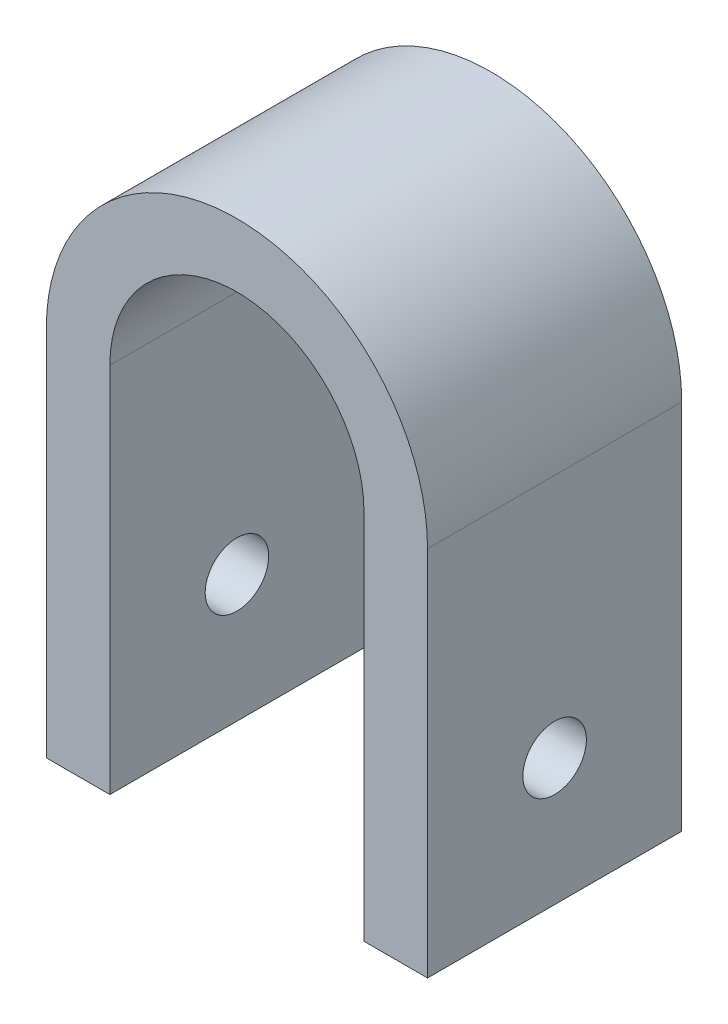
ISO-10303-21;
HEADER;
FILE_DESCRIPTION(('STEP AP214'),'2;1');
FILE_NAME('part.step','',(''),(''),'','','');
FILE_SCHEMA(('AUTOMOTIVE_DESIGN { 1 0 10303 214 1 1 1 1 }'));
ENDSEC;
DATA;
#1=APPLICATION_CONTEXT('core data for automotive mechanical design processes');
#2=APPLICATION_PROTOCOL_DEFINITION('international standard','automotive_design',2000,#1);
#3=PRODUCT_CONTEXT('',#1,'mechanical');
#4=PRODUCT('Part','Part','',(#3));
#5=PRODUCT_RELATED_PRODUCT_CATEGORY('part','',(#4));
#6=PRODUCT_DEFINITION_FORMATION('','',#4);
#7=PRODUCT_DEFINITION_CONTEXT('part definition',#1,'design');
#8=PRODUCT_DEFINITION('design','',#6,#7);
#9=PRODUCT_DEFINITION_SHAPE('','',#8);
#10=(LENGTH_UNIT() NAMED_UNIT(*) SI_UNIT(.MILLI.,.METRE.));
#11=(NAMED_UNIT(*) PLANE_ANGLE_UNIT() SI_UNIT($,.RADIAN.));
#12=(NAMED_UNIT(*) SI_UNIT($,.STERADIAN.) SOLID_ANGLE_UNIT());
#13=UNCERTAINTY_MEASURE_WITH_UNIT(LENGTH_MEASURE(1.E-05),#10,'distance_accuracy_value','');
#14=(GEOMETRIC_REPRESENTATION_CONTEXT(3) GLOBAL_UNCERTAINTY_ASSIGNED_CONTEXT((#13)) GLOBAL_UNIT_ASSIGNED_CONTEXT((#10,
#11,#12)) REPRESENTATION_CONTEXT('',''));
#15=CARTESIAN_POINT('',(0.,0.,0.));
#16=DIRECTION('',(0.,0.,1.));
#17=DIRECTION('',(1.,0.,0.));
#18=AXIS2_PLACEMENT_3D('',#15,#16,#17);
#19=CARTESIAN_POINT('',(0.,0.,8.));
#20=DIRECTION('',(0.,0.,-1.));
#21=DIRECTION('',(-1.,0.,0.));
#22=AXIS2_PLACEMENT_3D('',#19,#20,#21);
#23=CYLINDRICAL_SURFACE('',#22,4.);
#24=CARTESIAN_POINT('',(0.,0.,0.));
#25=DIRECTION('',(0.,0.,-1.));
#26=DIRECTION('',(1.,0.,0.));
#27=AXIS2_PLACEMENT_3D('',#24,#25,#26);
#28=CIRCLE('',#27,4.);
#29=CARTESIAN_POINT('',(-4.,0.,0.));
#30=VERTEX_POINT('',#29);
#31=CARTESIAN_POINT('',(4.,0.,0.));
#32=VERTEX_POINT('',#31);
#33=EDGE_CURVE('E130',#30,#32,#28,.T.);
#34=ORIENTED_EDGE('',*,*,#33,.T.);
#35=DIRECTION('',(0.,0.,-1.));
#36=VECTOR('',#35,1.);
#37=CARTESIAN_POINT('',(4.,0.,8.));
#38=LINE('',#37,#36);
#39=CARTESIAN_POINT('',(4.,0.,8.));
#40=VERTEX_POINT('',#39);
#41=EDGE_CURVE('E11',#40,#32,#38,.T.);
#42=ORIENTED_EDGE('',*,*,#41,.F.);
#43=CARTESIAN_POINT('',(0.,0.,8.));
#44=DIRECTION('',(0.,0.,-1.));
#45=DIRECTION('',(1.,0.,0.));
#46=AXIS2_PLACEMENT_3D('',#43,#44,#45);
#47=CIRCLE('',#46,4.);
#48=CARTESIAN_POINT('',(-4.,0.,8.));
#49=VERTEX_POINT('',#48);
#50=EDGE_CURVE('E145',#49,#40,#47,.T.);
#51=ORIENTED_EDGE('',*,*,#50,.F.);
#52=DIRECTION('',(0.,0.,-1.));
#53=VECTOR('',#52,1.);
#54=CARTESIAN_POINT('',(-4.,0.,8.));
#55=LINE('',#54,#53);
#56=EDGE_CURVE('E126',#49,#30,#55,.T.);
#57=ORIENTED_EDGE('',*,*,#56,.T.);
#58=EDGE_LOOP('',(#34,#42,#51,#57));
#59=FACE_BOUND('',#58,.T.);
#60=ADVANCED_FACE('F33',(#59),#23,.F.);
#61=CARTESIAN_POINT('',(4.,0.,8.));
#62=DIRECTION('',(1.,-5.94859942086409E-11,0.));
#63=DIRECTION('',(5.94859942086409E-11,1.,0.));
#64=AXIS2_PLACEMENT_3D('',#61,#62,#63);
#65=PLANE('',#64);
#66=CARTESIAN_POINT('',(3.99999999954187,-7.7015254759383,4.));
#67=DIRECTION('',(1.,-5.94859942086409E-11,0.));
#68=DIRECTION('',(5.94859942086409E-11,1.,0.));
#69=AXIS2_PLACEMENT_3D('',#66,#67,#68);
#70=CIRCLE('',#69,1.);
#71=CARTESIAN_POINT('',(3.99999999954187,-7.7015254759383,5.));
#72=VERTEX_POINT('',#71);
#73=EDGE_CURVE('E134',#72,#72,#70,.T.);
#74=ORIENTED_EDGE('',*,*,#73,.T.);
#75=EDGE_LOOP('',(#74));
#76=FACE_BOUND('',#75,.T.);
#77=DIRECTION('',(-5.94859942086409E-11,-1.,0.));
#78=VECTOR('',#77,1.);
#79=CARTESIAN_POINT('',(4.,0.,0.));
#80=LINE('',#79,#78);
#81=CARTESIAN_POINT('',(3.99999999930393,-11.7015254759383,0.));
#82=VERTEX_POINT('',#81);
#83=EDGE_CURVE('E133',#32,#82,#80,.T.);
#84=ORIENTED_EDGE('',*,*,#83,.T.);
#85=DIRECTION('',(0.,0.,-1.));
#86=VECTOR('',#85,1.);
#87=CARTESIAN_POINT('',(3.99999999930393,-11.7015254759383,8.));
#88=LINE('',#87,#86);
#89=CARTESIAN_POINT('',(3.99999999930393,-11.7015254759383,8.));
#90=VERTEX_POINT('',#89);
#91=EDGE_CURVE('E42',#90,#82,#88,.T.);
#92=ORIENTED_EDGE('',*,*,#91,.F.);
#93=DIRECTION('',(-5.94859942086409E-11,-1.,0.));
#94=VECTOR('',#93,1.);
#95=CARTESIAN_POINT('',(4.,0.,8.));
#96=LINE('',#95,#94);
#97=EDGE_CURVE('E93',#40,#90,#96,.T.);
#98=ORIENTED_EDGE('',*,*,#97,.F.);
#99=ORIENTED_EDGE('',*,*,#41,.T.);
#100=EDGE_LOOP('',(#84,#92,#98,#99));
#101=FACE_BOUND('',#100,.T.);
#102=ADVANCED_FACE('F206',(#76,#101),#65,.F.);
#103=CARTESIAN_POINT('',(6.,-11.7015254759383,8.));
#104=DIRECTION('',(0.,1.,0.));
#105=DIRECTION('',(0.,0.,1.));
#106=AXIS2_PLACEMENT_3D('',#103,#104,#105);
#107=PLANE('',#106);
#108=DIRECTION('',(1.,0.,0.));
#109=VECTOR('',#108,1.);
#110=CARTESIAN_POINT('',(6.,-11.7015254759383,0.));
#111=LINE('',#110,#109);
#112=CARTESIAN_POINT('',(6.,-11.7015254759383,0.));
#113=VERTEX_POINT('',#112);
#114=EDGE_CURVE('E136',#82,#113,#111,.T.);
#115=ORIENTED_EDGE('',*,*,#114,.T.);
#116=DIRECTION('',(0.,0.,-1.));
#117=VECTOR('',#116,1.);
#118=CARTESIAN_POINT('',(6.,-11.7015254759383,8.));
#119=LINE('',#118,#117);
#120=CARTESIAN_POINT('',(6.,-11.7015254759383,8.));
#121=VERTEX_POINT('',#120);
#122=EDGE_CURVE('E152',#121,#113,#119,.T.);
#123=ORIENTED_EDGE('',*,*,#122,.F.);
#124=DIRECTION('',(1.,0.,0.));
#125=VECTOR('',#124,1.);
#126=CARTESIAN_POINT('',(6.,-11.7015254759383,8.));
#127=LINE('',#126,#125);
#128=EDGE_CURVE('E161',#90,#121,#127,.T.);
#129=ORIENTED_EDGE('',*,*,#128,.F.);
#130=ORIENTED_EDGE('',*,*,#91,.T.);
#131=EDGE_LOOP('',(#115,#123,#129,#130));
#132=FACE_BOUND('',#131,.T.);
#133=ADVANCED_FACE('F159',(#132),#107,.F.);
#134=CARTESIAN_POINT('',(6.,0.,8.));
#135=DIRECTION('',(-1.,0.,0.));
#136=DIRECTION('',(0.,0.,1.));
#137=AXIS2_PLACEMENT_3D('',#134,#135,#136);
#138=PLANE('',#137);
#139=CARTESIAN_POINT('',(6.,-7.7015254759383,4.));
#140=DIRECTION('',(-1.,0.,0.));
#141=DIRECTION('',(0.,0.,1.));
#142=AXIS2_PLACEMENT_3D('',#139,#140,#141);
#143=CIRCLE('',#142,1.);
#144=CARTESIAN_POINT('',(6.,-7.7015254759383,5.));
#145=VERTEX_POINT('',#144);
#146=EDGE_CURVE('E184',#145,#145,#143,.T.);
#147=ORIENTED_EDGE('',*,*,#146,.T.);
#148=EDGE_LOOP('',(#147));
#149=FACE_BOUND('',#148,.T.);
#150=DIRECTION('',(0.,1.,0.));
#151=VECTOR('',#150,1.);
#152=CARTESIAN_POINT('',(6.,0.,0.));
#153=LINE('',#152,#151);
#154=CARTESIAN_POINT('',(6.,0.,0.));
#155=VERTEX_POINT('',#154);
#156=EDGE_CURVE('E138',#113,#155,#153,.T.);
#157=ORIENTED_EDGE('',*,*,#156,.T.);
#158=DIRECTION('',(0.,0.,-1.));
#159=VECTOR('',#158,1.);
#160=CARTESIAN_POINT('',(6.,0.,8.));
#161=LINE('',#160,#159);
#162=CARTESIAN_POINT('',(6.,0.,8.));
#163=VERTEX_POINT('',#162);
#164=EDGE_CURVE('E149',#163,#155,#161,.T.);
#165=ORIENTED_EDGE('',*,*,#164,.F.);
#166=DIRECTION('',(0.,1.,0.));
#167=VECTOR('',#166,1.);
#168=CARTESIAN_POINT('',(6.,0.,8.));
#169=LINE('',#168,#167);
#170=EDGE_CURVE('E173',#121,#163,#169,.T.);
#171=ORIENTED_EDGE('',*,*,#170,.F.);
#172=ORIENTED_EDGE('',*,*,#122,.T.);
#173=EDGE_LOOP('',(#157,#165,#171,#172));
#174=FACE_BOUND('',#173,.T.);
#175=ADVANCED_FACE('F169',(#149,#174),#138,.F.);
#176=CARTESIAN_POINT('',(0.,0.,8.));
#177=DIRECTION('',(0.,0.,-1.));
#178=DIRECTION('',(-1.,0.,0.));
#179=AXIS2_PLACEMENT_3D('',#176,#177,#178);
#180=CYLINDRICAL_SURFACE('',#179,6.);
#181=CARTESIAN_POINT('',(0.,0.,0.));
#182=DIRECTION('',(0.,0.,1.));
#183=DIRECTION('',(1.,0.,0.));
#184=AXIS2_PLACEMENT_3D('',#181,#182,#183);
#185=CIRCLE('',#184,6.);
#186=CARTESIAN_POINT('',(-6.,0.,0.));
#187=VERTEX_POINT('',#186);
#188=EDGE_CURVE('E140',#155,#187,#185,.T.);
#189=ORIENTED_EDGE('',*,*,#188,.T.);
#190=DIRECTION('',(0.,0.,-1.));
#191=VECTOR('',#190,1.);
#192=CARTESIAN_POINT('',(-6.,0.,8.));
#193=LINE('',#192,#191);
#194=CARTESIAN_POINT('',(-6.,0.,8.));
#195=VERTEX_POINT('',#194);
#196=EDGE_CURVE('E121',#195,#187,#193,.T.);
#197=ORIENTED_EDGE('',*,*,#196,.F.);
#198=CARTESIAN_POINT('',(0.,0.,8.));
#199=DIRECTION('',(0.,0.,1.));
#200=DIRECTION('',(1.,0.,0.));
#201=AXIS2_PLACEMENT_3D('',#198,#199,#200);
#202=CIRCLE('',#201,6.);
#203=EDGE_CURVE('E112',#163,#195,#202,.T.);
#204=ORIENTED_EDGE('',*,*,#203,.F.);
#205=ORIENTED_EDGE('',*,*,#164,.T.);
#206=EDGE_LOOP('',(#189,#197,#204,#205));
#207=FACE_BOUND('',#206,.T.);
#208=ADVANCED_FACE('F172',(#207),#180,.T.);
#209=CARTESIAN_POINT('',(-6.,0.,8.));
#210=DIRECTION('',(1.,0.,0.));
#211=DIRECTION('',(0.,0.,-1.));
#212=AXIS2_PLACEMENT_3D('',#209,#210,#211);
#213=PLANE('',#212);
#214=CARTESIAN_POINT('',(-6.,-7.7015254759383,4.));
#215=DIRECTION('',(-1.,0.,0.));
#216=DIRECTION('',(0.,0.,1.));
#217=AXIS2_PLACEMENT_3D('',#214,#215,#216);
#218=CIRCLE('',#217,1.);
#219=CARTESIAN_POINT('',(-6.,-7.7015254759383,5.));
#220=VERTEX_POINT('',#219);
#221=EDGE_CURVE('E181',#220,#220,#218,.T.);
#222=ORIENTED_EDGE('',*,*,#221,.F.);
#223=EDGE_LOOP('',(#222));
#224=FACE_BOUND('',#223,.T.);
#225=DIRECTION('',(0.,-1.,0.));
#226=VECTOR('',#225,1.);
#227=CARTESIAN_POINT('',(-6.,0.,0.));
#228=LINE('',#227,#226);
#229=CARTESIAN_POINT('',(-6.,-11.7015254759383,0.));
#230=VERTEX_POINT('',#229);
#231=EDGE_CURVE('E120',#187,#230,#228,.T.);
#232=ORIENTED_EDGE('',*,*,#231,.T.);
#233=DIRECTION('',(0.,0.,-1.));
#234=VECTOR('',#233,1.);
#235=CARTESIAN_POINT('',(-6.,-11.7015254759383,8.));
#236=LINE('',#235,#234);
#237=CARTESIAN_POINT('',(-6.,-11.7015254759383,8.));
#238=VERTEX_POINT('',#237);
#239=EDGE_CURVE('E117',#238,#230,#236,.T.);
#240=ORIENTED_EDGE('',*,*,#239,.F.);
#241=DIRECTION('',(0.,-1.,0.));
#242=VECTOR('',#241,1.);
#243=CARTESIAN_POINT('',(-6.,0.,8.));
#244=LINE('',#243,#242);
#245=EDGE_CURVE('E106',#195,#238,#244,.T.);
#246=ORIENTED_EDGE('',*,*,#245,.F.);
#247=ORIENTED_EDGE('',*,*,#196,.T.);
#248=EDGE_LOOP('',(#232,#240,#246,#247));
#249=FACE_BOUND('',#248,.T.);
#250=ADVANCED_FACE('F118',(#224,#249),#213,.F.);
#251=CARTESIAN_POINT('',(-6.,-11.7015254759383,8.));
#252=DIRECTION('',(0.,1.,0.));
#253=DIRECTION('',(0.,0.,1.));
#254=AXIS2_PLACEMENT_3D('',#251,#252,#253);
#255=PLANE('',#254);
#256=DIRECTION('',(1.,0.,0.));
#257=VECTOR('',#256,1.);
#258=CARTESIAN_POINT('',(-6.,-11.7015254759383,0.));
#259=LINE('',#258,#257);
#260=CARTESIAN_POINT('',(-3.99999999999999,-11.7015254759383,0.));
#261=VERTEX_POINT('',#260);
#262=EDGE_CURVE('E79',#230,#261,#259,.T.);
#263=ORIENTED_EDGE('',*,*,#262,.T.);
#264=DIRECTION('',(0.,0.,-1.));
#265=VECTOR('',#264,1.);
#266=CARTESIAN_POINT('',(-3.99999999999999,-11.7015254759383,8.));
#267=LINE('',#266,#265);
#268=CARTESIAN_POINT('',(-3.99999999999999,-11.7015254759383,8.));
#269=VERTEX_POINT('',#268);
#270=EDGE_CURVE('E122',#269,#261,#267,.T.);
#271=ORIENTED_EDGE('',*,*,#270,.F.);
#272=DIRECTION('',(1.,0.,0.));
#273=VECTOR('',#272,1.);
#274=CARTESIAN_POINT('',(-6.,-11.7015254759383,8.));
#275=LINE('',#274,#273);
#276=EDGE_CURVE('E110',#238,#269,#275,.T.);
#277=ORIENTED_EDGE('',*,*,#276,.F.);
#278=ORIENTED_EDGE('',*,*,#239,.T.);
#279=EDGE_LOOP('',(#263,#271,#277,#278));
#280=FACE_BOUND('',#279,.T.);
#281=ADVANCED_FACE('F124',(#280),#255,.F.);
#282=CARTESIAN_POINT('',(-4.,0.,8.));
#283=DIRECTION('',(-1.,0.,0.));
#284=DIRECTION('',(0.,-1.,0.));
#285=AXIS2_PLACEMENT_3D('',#282,#283,#284);
#286=PLANE('',#285);
#287=CARTESIAN_POINT('',(-3.99999999999999,-7.7015254759383,4.));
#288=DIRECTION('',(-1.,0.,0.));
#289=DIRECTION('',(0.,-1.,0.));
#290=AXIS2_PLACEMENT_3D('',#287,#288,#289);
#291=CIRCLE('',#290,1.);
#292=CARTESIAN_POINT('',(-3.99999999999999,-7.7015254759383,5.));
#293=VERTEX_POINT('',#292);
#294=EDGE_CURVE('E36',#293,#293,#291,.T.);
#295=ORIENTED_EDGE('',*,*,#294,.T.);
#296=EDGE_LOOP('',(#295));
#297=FACE_BOUND('',#296,.T.);
#298=DIRECTION('',(0.,1.,0.));
#299=VECTOR('',#298,1.);
#300=CARTESIAN_POINT('',(-4.,0.,0.));
#301=LINE('',#300,#299);
#302=EDGE_CURVE('E85',#261,#30,#301,.T.);
#303=ORIENTED_EDGE('',*,*,#302,.T.);
#304=ORIENTED_EDGE('',*,*,#56,.F.);
#305=DIRECTION('',(0.,1.,0.));
#306=VECTOR('',#305,1.);
#307=CARTESIAN_POINT('',(-4.,0.,8.));
#308=LINE('',#307,#306);
#309=EDGE_CURVE('E50',#269,#49,#308,.T.);
#310=ORIENTED_EDGE('',*,*,#309,.F.);
#311=ORIENTED_EDGE('',*,*,#270,.T.);
#312=EDGE_LOOP('',(#303,#304,#310,#311));
#313=FACE_BOUND('',#312,.T.);
#314=ADVANCED_FACE('F191',(#297,#313),#286,.F.);
#315=CARTESIAN_POINT('',(0.,0.,8.));
#316=DIRECTION('',(0.,0.,1.));
#317=DIRECTION('',(1.,0.,0.));
#318=AXIS2_PLACEMENT_3D('',#315,#316,#317);
#319=PLANE('',#318);
#320=ORIENTED_EDGE('',*,*,#50,.T.);
#321=ORIENTED_EDGE('',*,*,#97,.T.);
#322=ORIENTED_EDGE('',*,*,#128,.T.);
#323=ORIENTED_EDGE('',*,*,#170,.T.);
#324=ORIENTED_EDGE('',*,*,#203,.T.);
#325=ORIENTED_EDGE('',*,*,#245,.T.);
#326=ORIENTED_EDGE('',*,*,#276,.T.);
#327=ORIENTED_EDGE('',*,*,#309,.T.);
#328=EDGE_LOOP('',(#320,#321,#322,#323,#324,#325,#326,#327));
#329=FACE_BOUND('',#328,.T.);
#330=ADVANCED_FACE('F108',(#329),#319,.T.);
#331=CARTESIAN_POINT('',(0.,0.,0.));
#332=DIRECTION('',(0.,0.,1.));
#333=DIRECTION('',(1.,0.,0.));
#334=AXIS2_PLACEMENT_3D('',#331,#332,#333);
#335=PLANE('',#334);
#336=ORIENTED_EDGE('',*,*,#33,.F.);
#337=ORIENTED_EDGE('',*,*,#302,.F.);
#338=ORIENTED_EDGE('',*,*,#262,.F.);
#339=ORIENTED_EDGE('',*,*,#231,.F.);
#340=ORIENTED_EDGE('',*,*,#188,.F.);
#341=ORIENTED_EDGE('',*,*,#156,.F.);
#342=ORIENTED_EDGE('',*,*,#114,.F.);
#343=ORIENTED_EDGE('',*,*,#83,.F.);
#344=EDGE_LOOP('',(#336,#337,#338,#339,#340,#341,#342,#343));
#345=FACE_BOUND('',#344,.T.);
#346=ADVANCED_FACE('F165',(#345),#335,.F.);
#347=CARTESIAN_POINT('',(6.,-7.7015254759383,4.));
#348=DIRECTION('',(-1.,0.,0.));
#349=DIRECTION('',(0.,0.,1.));
#350=AXIS2_PLACEMENT_3D('',#347,#348,#349);
#351=CYLINDRICAL_SURFACE('',#350,1.);
#352=CARTESIAN_POINT('',(-6.,-7.7015254759383,5.));
#353=CARTESIAN_POINT('',(-5.97916666666667,-7.7015254759383,5.));
#354=CARTESIAN_POINT('',(-5.95833333333333,-7.7015254759383,5.));
#355=CARTESIAN_POINT('',(-5.91666666666667,-7.7015254759383,5.));
#356=CARTESIAN_POINT('',(-5.89583333333333,-7.7015254759383,5.));
#357=CARTESIAN_POINT('',(-5.85416666666667,-7.7015254759383,5.));
#358=CARTESIAN_POINT('',(-5.83333333333333,-7.7015254759383,5.));
#359=CARTESIAN_POINT('',(-5.79166666666667,-7.7015254759383,5.));
#360=CARTESIAN_POINT('',(-5.77083333333333,-7.7015254759383,5.));
#361=CARTESIAN_POINT('',(-5.72916666666667,-7.7015254759383,5.));
#362=CARTESIAN_POINT('',(-5.70833333333333,-7.7015254759383,5.));
#363=CARTESIAN_POINT('',(-5.66666666666667,-7.7015254759383,5.));
#364=CARTESIAN_POINT('',(-5.64583333333333,-7.7015254759383,5.));
#365=CARTESIAN_POINT('',(-5.60416666666667,-7.7015254759383,5.));
#366=CARTESIAN_POINT('',(-5.58333333333333,-7.7015254759383,5.));
#367=CARTESIAN_POINT('',(-5.54166666666667,-7.7015254759383,5.));
#368=CARTESIAN_POINT('',(-5.52083333333333,-7.7015254759383,5.));
#369=CARTESIAN_POINT('',(-5.47916666666667,-7.7015254759383,5.));
#370=CARTESIAN_POINT('',(-5.45833333333333,-7.7015254759383,5.));
#371=CARTESIAN_POINT('',(-5.41666666666667,-7.7015254759383,5.));
#372=CARTESIAN_POINT('',(-5.39583333333333,-7.7015254759383,5.));
#373=CARTESIAN_POINT('',(-5.35416666666667,-7.7015254759383,5.));
#374=CARTESIAN_POINT('',(-5.33333333333333,-7.7015254759383,5.));
#375=CARTESIAN_POINT('',(-5.29166666666667,-7.7015254759383,5.));
#376=CARTESIAN_POINT('',(-5.27083333333333,-7.7015254759383,5.));
#377=CARTESIAN_POINT('',(-5.22916666666666,-7.7015254759383,5.));
#378=CARTESIAN_POINT('',(-5.20833333333333,-7.7015254759383,5.));
#379=CARTESIAN_POINT('',(-5.16666666666666,-7.7015254759383,5.));
#380=CARTESIAN_POINT('',(-5.14583333333333,-7.7015254759383,5.));
#381=CARTESIAN_POINT('',(-5.10416666666666,-7.7015254759383,5.));
#382=CARTESIAN_POINT('',(-5.08333333333333,-7.7015254759383,5.));
#383=CARTESIAN_POINT('',(-5.04166666666666,-7.7015254759383,5.));
#384=CARTESIAN_POINT('',(-5.02083333333333,-7.7015254759383,5.));
#385=CARTESIAN_POINT('',(-4.97916666666666,-7.7015254759383,5.));
#386=CARTESIAN_POINT('',(-4.95833333333333,-7.7015254759383,5.));
#387=CARTESIAN_POINT('',(-4.91666666666666,-7.7015254759383,5.));
#388=CARTESIAN_POINT('',(-4.89583333333333,-7.7015254759383,5.));
#389=CARTESIAN_POINT('',(-4.85416666666666,-7.7015254759383,5.));
#390=CARTESIAN_POINT('',(-4.83333333333333,-7.7015254759383,5.));
#391=CARTESIAN_POINT('',(-4.79166666666666,-7.7015254759383,5.));
#392=CARTESIAN_POINT('',(-4.77083333333333,-7.7015254759383,5.));
#393=CARTESIAN_POINT('',(-4.72916666666666,-7.7015254759383,5.));
#394=CARTESIAN_POINT('',(-4.70833333333333,-7.7015254759383,5.));
#395=CARTESIAN_POINT('',(-4.66666666666666,-7.7015254759383,5.));
#396=CARTESIAN_POINT('',(-4.64583333333333,-7.7015254759383,5.));
#397=CARTESIAN_POINT('',(-4.60416666666666,-7.7015254759383,5.));
#398=CARTESIAN_POINT('',(-4.58333333333333,-7.7015254759383,5.));
#399=CARTESIAN_POINT('',(-4.54166666666666,-7.7015254759383,5.));
#400=CARTESIAN_POINT('',(-4.52083333333333,-7.7015254759383,5.));
#401=CARTESIAN_POINT('',(-4.47916666666666,-7.7015254759383,5.));
#402=CARTESIAN_POINT('',(-4.45833333333333,-7.7015254759383,5.));
#403=CARTESIAN_POINT('',(-4.41666666666666,-7.7015254759383,5.));
#404=CARTESIAN_POINT('',(-4.39583333333333,-7.7015254759383,5.));
#405=CARTESIAN_POINT('',(-4.35416666666666,-7.7015254759383,5.));
#406=CARTESIAN_POINT('',(-4.33333333333333,-7.7015254759383,5.));
#407=CARTESIAN_POINT('',(-4.29166666666666,-7.7015254759383,5.));
#408=CARTESIAN_POINT('',(-4.27083333333333,-7.7015254759383,5.));
#409=CARTESIAN_POINT('',(-4.22916666666666,-7.7015254759383,5.));
#410=CARTESIAN_POINT('',(-4.20833333333333,-7.7015254759383,5.));
#411=CARTESIAN_POINT('',(-4.16666666666666,-7.7015254759383,5.));
#412=CARTESIAN_POINT('',(-4.14583333333333,-7.7015254759383,5.));
#413=CARTESIAN_POINT('',(-4.10416666666666,-7.7015254759383,5.));
#414=CARTESIAN_POINT('',(-4.08333333333333,-7.7015254759383,5.));
#415=CARTESIAN_POINT('',(-4.04166666666666,-7.7015254759383,5.));
#416=CARTESIAN_POINT('',(-4.02083333333333,-7.7015254759383,5.));
#417=CARTESIAN_POINT('',(-3.99999999999999,-7.7015254759383,5.));
#418=B_SPLINE_CURVE_WITH_KNOTS('',3,(#352,#353,#354,#355,#356,#357,#358,#359,#360,#361,#362,
#363,#364,#365,#366,#367,#368,#369,#370,#371,#372,#373,#374,#375,#376,#377,#378,#379,#380,#381,
#382,#383,#384,#385,#386,#387,#388,#389,#390,#391,#392,#393,#394,#395,#396,#397,#398,#399,#400,
#401,#402,#403,#404,#405,#406,#407,#408,#409,#410,#411,#412,#413,#414,#415,#416,#417),
.UNSPECIFIED.,.F.,.F.,(4,2,2,2,2,2,2,2,2,2,2,2,2,2,2,2,2,2,2,2,2,2,2,2,2,2,2,2,2,2,2,2,4),(0.,
0.0625000000000001,0.125,0.1875,0.25,0.312500000000002,0.375000000000002,0.437500000000002,
0.500000000000002,0.562500000000002,0.625000000000002,0.687500000000002,0.750000000000004,
0.812500000000004,0.875000000000004,0.937500000000004,1.,1.0625,1.125,1.1875,1.25,
1.31250000000001,1.37500000000001,1.43750000000001,1.50000000000001,1.56250000000001,
1.62500000000001,1.68750000000001,1.75000000000001,1.81250000000001,1.87500000000001,
1.93750000000001,2.00000000000001),.UNSPECIFIED.);
#419=EDGE_CURVE('BSEAM193',#220,#293,#418,.T.);
#420=ORIENTED_EDGE('',*,*,#221,.T.);
#421=ORIENTED_EDGE('',*,*,#294,.F.);
#422=ORIENTED_EDGE('',*,*,#419,.T.);
#423=ORIENTED_EDGE('',*,*,#419,.F.);
#424=EDGE_LOOP('',(#420,#422,#421,#423));
#425=FACE_BOUND('',#424,.T.);
#426=ADVANCED_FACE('F193',(#425),#351,.F.);
#427=CARTESIAN_POINT('',(6.,-7.7015254759383,5.));
#428=CARTESIAN_POINT('',(5.9791666666619,-7.7015254759383,5.));
#429=CARTESIAN_POINT('',(5.95833333332379,-7.7015254759383,5.));
#430=CARTESIAN_POINT('',(5.91666666664758,-7.7015254759383,5.));
#431=CARTESIAN_POINT('',(5.89583333330947,-7.7015254759383,5.));
#432=CARTESIAN_POINT('',(5.85416666663326,-7.7015254759383,5.));
#433=CARTESIAN_POINT('',(5.83333333329516,-7.7015254759383,5.));
#434=CARTESIAN_POINT('',(5.79166666661895,-7.7015254759383,5.));
#435=CARTESIAN_POINT('',(5.77083333328084,-7.7015254759383,5.));
#436=CARTESIAN_POINT('',(5.72916666660463,-7.7015254759383,5.));
#437=CARTESIAN_POINT('',(5.70833333326652,-7.7015254759383,5.));
#438=CARTESIAN_POINT('',(5.66666666659031,-7.7015254759383,5.));
#439=CARTESIAN_POINT('',(5.64583333325221,-7.7015254759383,5.));
#440=CARTESIAN_POINT('',(5.604166666576,-7.7015254759383,5.));
#441=CARTESIAN_POINT('',(5.58333333323789,-7.7015254759383,5.));
#442=CARTESIAN_POINT('',(5.54166666656168,-7.7015254759383,5.));
#443=CARTESIAN_POINT('',(5.52083333322357,-7.7015254759383,5.));
#444=CARTESIAN_POINT('',(5.47916666654736,-7.7015254759383,5.));
#445=CARTESIAN_POINT('',(5.45833333320926,-7.7015254759383,5.));
#446=CARTESIAN_POINT('',(5.41666666653305,-7.7015254759383,5.));
#447=CARTESIAN_POINT('',(5.39583333319494,-7.7015254759383,5.));
#448=CARTESIAN_POINT('',(5.35416666651873,-7.7015254759383,5.));
#449=CARTESIAN_POINT('',(5.33333333318062,-7.7015254759383,5.));
#450=CARTESIAN_POINT('',(5.29166666650441,-7.7015254759383,5.));
#451=CARTESIAN_POINT('',(5.27083333316631,-7.7015254759383,5.));
#452=CARTESIAN_POINT('',(5.2291666664901,-7.7015254759383,5.));
#453=CARTESIAN_POINT('',(5.20833333315199,-7.7015254759383,5.));
#454=CARTESIAN_POINT('',(5.16666666647578,-7.7015254759383,5.));
#455=CARTESIAN_POINT('',(5.14583333313767,-7.7015254759383,5.));
#456=CARTESIAN_POINT('',(5.10416666646146,-7.7015254759383,5.));
#457=CARTESIAN_POINT('',(5.08333333312336,-7.7015254759383,5.));
#458=CARTESIAN_POINT('',(5.04166666644715,-7.7015254759383,5.));
#459=CARTESIAN_POINT('',(5.02083333310904,-7.7015254759383,5.));
#460=CARTESIAN_POINT('',(4.97916666643283,-7.7015254759383,5.));
#461=CARTESIAN_POINT('',(4.95833333309472,-7.7015254759383,5.));
#462=CARTESIAN_POINT('',(4.91666666641851,-7.7015254759383,5.));
#463=CARTESIAN_POINT('',(4.89583333308041,-7.7015254759383,5.));
#464=CARTESIAN_POINT('',(4.8541666664042,-7.7015254759383,5.));
#465=CARTESIAN_POINT('',(4.83333333306609,-7.7015254759383,5.));
#466=CARTESIAN_POINT('',(4.79166666638988,-7.7015254759383,5.));
#467=CARTESIAN_POINT('',(4.77083333305178,-7.7015254759383,5.));
#468=CARTESIAN_POINT('',(4.72916666637556,-7.7015254759383,5.));
#469=CARTESIAN_POINT('',(4.70833333303746,-7.7015254759383,5.));
#470=CARTESIAN_POINT('',(4.66666666636125,-7.7015254759383,5.));
#471=CARTESIAN_POINT('',(4.64583333302314,-7.7015254759383,5.));
#472=CARTESIAN_POINT('',(4.60416666634693,-7.7015254759383,5.));
#473=CARTESIAN_POINT('',(4.58333333300882,-7.7015254759383,5.));
#474=CARTESIAN_POINT('',(4.54166666633261,-7.7015254759383,5.));
#475=CARTESIAN_POINT('',(4.52083333299451,-7.7015254759383,5.));
#476=CARTESIAN_POINT('',(4.4791666663183,-7.7015254759383,5.));
#477=CARTESIAN_POINT('',(4.45833333298019,-7.7015254759383,5.));
#478=CARTESIAN_POINT('',(4.41666666630398,-7.7015254759383,5.));
#479=CARTESIAN_POINT('',(4.39583333296587,-7.7015254759383,5.));
#480=CARTESIAN_POINT('',(4.35416666628966,-7.7015254759383,5.));
#481=CARTESIAN_POINT('',(4.33333333295156,-7.7015254759383,5.));
#482=CARTESIAN_POINT('',(4.29166666627535,-7.7015254759383,5.));
#483=CARTESIAN_POINT('',(4.27083333293724,-7.7015254759383,5.));
#484=CARTESIAN_POINT('',(4.22916666626103,-7.7015254759383,5.));
#485=CARTESIAN_POINT('',(4.20833333292293,-7.7015254759383,5.));
#486=CARTESIAN_POINT('',(4.16666666624671,-7.7015254759383,5.));
#487=CARTESIAN_POINT('',(4.14583333290861,-7.7015254759383,5.));
#488=CARTESIAN_POINT('',(4.1041666662324,-7.7015254759383,5.));
#489=CARTESIAN_POINT('',(4.08333333289429,-7.7015254759383,5.));
#490=CARTESIAN_POINT('',(4.04166666621808,-7.7015254759383,5.));
#491=CARTESIAN_POINT('',(4.02083333287997,-7.7015254759383,5.));
#492=CARTESIAN_POINT('',(3.99999999954187,-7.7015254759383,5.));
#493=B_SPLINE_CURVE_WITH_KNOTS('',3,(#427,#428,#429,#430,#431,#432,#433,#434,#435,#436,#437,
#438,#439,#440,#441,#442,#443,#444,#445,#446,#447,#448,#449,#450,#451,#452,#453,#454,#455,#456,
#457,#458,#459,#460,#461,#462,#463,#464,#465,#466,#467,#468,#469,#470,#471,#472,#473,#474,#475,
#476,#477,#478,#479,#480,#481,#482,#483,#484,#485,#486,#487,#488,#489,#490,#491,#492),
.UNSPECIFIED.,.F.,.F.,(4,2,2,2,2,2,2,2,2,2,2,2,2,2,2,2,2,2,2,2,2,2,2,2,2,2,2,2,2,2,2,2,4),(0.,
0.0625000000143167,0.125000000028633,0.18750000004295,0.250000000057267,0.312500000071584,
0.3750000000859,0.437500000100217,0.500000000114534,0.56250000012885,0.625000000143166,
0.687500000157483,0.7500000001718,0.812500000186117,0.875000000200433,0.93750000021475,
1.00000000022907,1.06250000024338,1.1250000002577,1.18750000027202,1.25000000028633,
1.31250000030065,1.37500000031497,1.43750000032928,1.5000000003436,1.56250000035792,
1.62500000037223,1.68750000038655,1.75000000040087,1.81250000041518,1.8750000004295,
1.93750000044382,2.00000000045813),.UNSPECIFIED.);
#494=EDGE_CURVE('BSEAM195',#145,#72,#493,.T.);
#495=ORIENTED_EDGE('',*,*,#146,.F.);
#496=ORIENTED_EDGE('',*,*,#73,.F.);
#497=ORIENTED_EDGE('',*,*,#494,.T.);
#498=ORIENTED_EDGE('',*,*,#494,.F.);
#499=EDGE_LOOP('',(#495,#497,#496,#498));
#500=FACE_BOUND('',#499,.T.);
#501=ADVANCED_FACE('F195',(#500),#351,.F.);
#502=CLOSED_SHELL('',(#60,#102,#133,#175,#208,#250,#281,#314,#330,#346,#426,#501));
#503=MANIFOLD_SOLID_BREP('B2',#502);
#504=ADVANCED_BREP_SHAPE_REPRESENTATION('',(#18,#503),#14);
#505=SHAPE_DEFINITION_REPRESENTATION(#9,#504);
ENDSEC;
END-ISO-10303-21;
